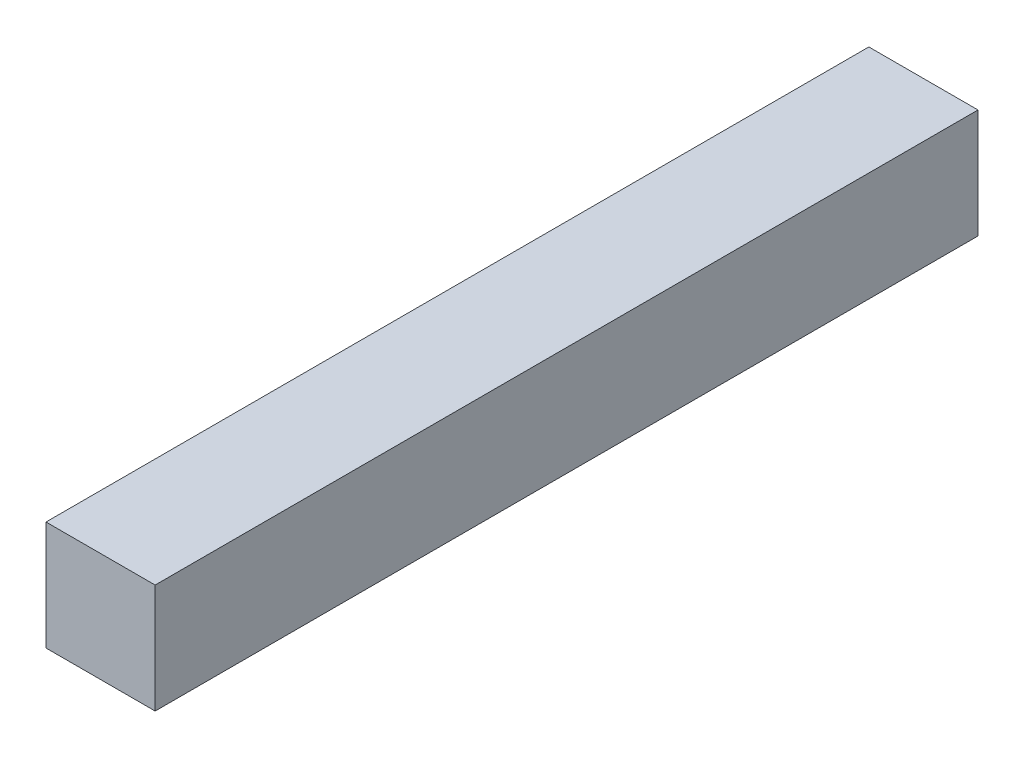
ISO-10303-21;
HEADER;
FILE_DESCRIPTION(('STEP AP214'),'2;1');
FILE_NAME('part.step','',(''),(''),'','','');
FILE_SCHEMA(('AUTOMOTIVE_DESIGN { 1 0 10303 214 1 1 1 1 }'));
ENDSEC;
DATA;
#1=APPLICATION_CONTEXT('core data for automotive mechanical design processes');
#2=APPLICATION_PROTOCOL_DEFINITION('international standard','automotive_design',2000,#1);
#3=PRODUCT_CONTEXT('',#1,'mechanical');
#4=PRODUCT('Part','Part','',(#3));
#5=PRODUCT_RELATED_PRODUCT_CATEGORY('part','',(#4));
#6=PRODUCT_DEFINITION_FORMATION('','',#4);
#7=PRODUCT_DEFINITION_CONTEXT('part definition',#1,'design');
#8=PRODUCT_DEFINITION('design','',#6,#7);
#9=PRODUCT_DEFINITION_SHAPE('','',#8);
#10=(LENGTH_UNIT() NAMED_UNIT(*) SI_UNIT(.MILLI.,.METRE.));
#11=(NAMED_UNIT(*) PLANE_ANGLE_UNIT() SI_UNIT($,.RADIAN.));
#12=(NAMED_UNIT(*) SI_UNIT($,.STERADIAN.) SOLID_ANGLE_UNIT());
#13=UNCERTAINTY_MEASURE_WITH_UNIT(LENGTH_MEASURE(1.E-05),#10,'distance_accuracy_value','');
#14=(GEOMETRIC_REPRESENTATION_CONTEXT(3) GLOBAL_UNCERTAINTY_ASSIGNED_CONTEXT((#13)) GLOBAL_UNIT_ASSIGNED_CONTEXT((#10,
#11,#12)) REPRESENTATION_CONTEXT('',''));
#15=CARTESIAN_POINT('',(0.,0.,0.));
#16=DIRECTION('',(0.,0.,1.));
#17=DIRECTION('',(1.,0.,0.));
#18=AXIS2_PLACEMENT_3D('',#15,#16,#17);
#19=CARTESIAN_POINT('',(0.,0.,-98.));
#20=DIRECTION('',(0.,-1.,0.));
#21=DIRECTION('',(0.,0.,-1.));
#22=AXIS2_PLACEMENT_3D('',#19,#20,#21);
#23=PLANE('',#22);
#24=DIRECTION('',(1.,0.,0.));
#25=VECTOR('',#24,1.);
#26=CARTESIAN_POINT('',(0.,0.,0.));
#27=LINE('',#26,#25);
#28=CARTESIAN_POINT('',(0.,0.,0.));
#29=VERTEX_POINT('',#28);
#30=CARTESIAN_POINT('',(13.,0.,0.));
#31=VERTEX_POINT('',#30);
#32=EDGE_CURVE('E108',#29,#31,#27,.T.);
#33=ORIENTED_EDGE('',*,*,#32,.F.);
#34=DIRECTION('',(0.,0.,1.));
#35=VECTOR('',#34,1.);
#36=CARTESIAN_POINT('',(0.,0.,-98.));
#37=LINE('',#36,#35);
#38=CARTESIAN_POINT('',(0.,0.,-98.));
#39=VERTEX_POINT('',#38);
#40=EDGE_CURVE('E11',#39,#29,#37,.T.);
#41=ORIENTED_EDGE('',*,*,#40,.F.);
#42=DIRECTION('',(1.,0.,0.));
#43=VECTOR('',#42,1.);
#44=CARTESIAN_POINT('',(0.,0.,-98.));
#45=LINE('',#44,#43);
#46=CARTESIAN_POINT('',(13.,0.,-98.));
#47=VERTEX_POINT('',#46);
#48=EDGE_CURVE('E101',#39,#47,#45,.T.);
#49=ORIENTED_EDGE('',*,*,#48,.T.);
#50=DIRECTION('',(0.,0.,1.));
#51=VECTOR('',#50,1.);
#52=CARTESIAN_POINT('',(13.,0.,-98.));
#53=LINE('',#52,#51);
#54=EDGE_CURVE('E40',#47,#31,#53,.T.);
#55=ORIENTED_EDGE('',*,*,#54,.T.);
#56=EDGE_LOOP('',(#33,#41,#49,#55));
#57=FACE_BOUND('',#56,.T.);
#58=ADVANCED_FACE('F37',(#57),#23,.T.);
#59=CARTESIAN_POINT('',(0.,0.,-98.));
#60=DIRECTION('',(1.,0.,0.));
#61=DIRECTION('',(0.,1.,0.));
#62=AXIS2_PLACEMENT_3D('',#59,#60,#61);
#63=PLANE('',#62);
#64=DIRECTION('',(0.,1.,0.));
#65=VECTOR('',#64,1.);
#66=CARTESIAN_POINT('',(0.,0.,0.));
#67=LINE('',#66,#65);
#68=CARTESIAN_POINT('',(0.,13.,0.));
#69=VERTEX_POINT('',#68);
#70=EDGE_CURVE('E71',#29,#69,#67,.T.);
#71=ORIENTED_EDGE('',*,*,#70,.T.);
#72=DIRECTION('',(0.,0.,1.));
#73=VECTOR('',#72,1.);
#74=CARTESIAN_POINT('',(0.,13.,-98.));
#75=LINE('',#74,#73);
#76=CARTESIAN_POINT('',(0.,13.,-98.));
#77=VERTEX_POINT('',#76);
#78=EDGE_CURVE('E47',#77,#69,#75,.T.);
#79=ORIENTED_EDGE('',*,*,#78,.F.);
#80=DIRECTION('',(0.,1.,0.));
#81=VECTOR('',#80,1.);
#82=CARTESIAN_POINT('',(0.,0.,-98.));
#83=LINE('',#82,#81);
#84=EDGE_CURVE('E88',#39,#77,#83,.T.);
#85=ORIENTED_EDGE('',*,*,#84,.F.);
#86=ORIENTED_EDGE('',*,*,#40,.T.);
#87=EDGE_LOOP('',(#71,#79,#85,#86));
#88=FACE_BOUND('',#87,.T.);
#89=ADVANCED_FACE('F124',(#88),#63,.F.);
#90=CARTESIAN_POINT('',(0.,13.,-98.));
#91=DIRECTION('',(0.,-1.,0.));
#92=DIRECTION('',(0.,0.,-1.));
#93=AXIS2_PLACEMENT_3D('',#90,#91,#92);
#94=PLANE('',#93);
#95=DIRECTION('',(1.,0.,0.));
#96=VECTOR('',#95,1.);
#97=CARTESIAN_POINT('',(0.,13.,0.));
#98=LINE('',#97,#96);
#99=CARTESIAN_POINT('',(13.,13.,0.));
#100=VERTEX_POINT('',#99);
#101=EDGE_CURVE('E96',#69,#100,#98,.T.);
#102=ORIENTED_EDGE('',*,*,#101,.T.);
#103=DIRECTION('',(0.,0.,1.));
#104=VECTOR('',#103,1.);
#105=CARTESIAN_POINT('',(13.,13.,-98.));
#106=LINE('',#105,#104);
#107=CARTESIAN_POINT('',(13.,13.,-98.));
#108=VERTEX_POINT('',#107);
#109=EDGE_CURVE('E93',#108,#100,#106,.T.);
#110=ORIENTED_EDGE('',*,*,#109,.F.);
#111=DIRECTION('',(1.,0.,0.));
#112=VECTOR('',#111,1.);
#113=CARTESIAN_POINT('',(0.,13.,-98.));
#114=LINE('',#113,#112);
#115=EDGE_CURVE('E83',#77,#108,#114,.T.);
#116=ORIENTED_EDGE('',*,*,#115,.F.);
#117=ORIENTED_EDGE('',*,*,#78,.T.);
#118=EDGE_LOOP('',(#102,#110,#116,#117));
#119=FACE_BOUND('',#118,.T.);
#120=ADVANCED_FACE('F94',(#119),#94,.F.);
#121=CARTESIAN_POINT('',(13.,0.,-98.));
#122=DIRECTION('',(1.,0.,0.));
#123=DIRECTION('',(0.,1.,0.));
#124=AXIS2_PLACEMENT_3D('',#121,#122,#123);
#125=PLANE('',#124);
#126=DIRECTION('',(0.,1.,0.));
#127=VECTOR('',#126,1.);
#128=CARTESIAN_POINT('',(13.,0.,0.));
#129=LINE('',#128,#127);
#130=EDGE_CURVE('E112',#31,#100,#129,.T.);
#131=ORIENTED_EDGE('',*,*,#130,.F.);
#132=ORIENTED_EDGE('',*,*,#54,.F.);
#133=DIRECTION('',(0.,1.,0.));
#134=VECTOR('',#133,1.);
#135=CARTESIAN_POINT('',(13.,0.,-98.));
#136=LINE('',#135,#134);
#137=EDGE_CURVE('E87',#47,#108,#136,.T.);
#138=ORIENTED_EDGE('',*,*,#137,.T.);
#139=ORIENTED_EDGE('',*,*,#109,.T.);
#140=EDGE_LOOP('',(#131,#132,#138,#139));
#141=FACE_BOUND('',#140,.T.);
#142=ADVANCED_FACE('F99',(#141),#125,.T.);
#143=CARTESIAN_POINT('',(0.,0.,-98.));
#144=DIRECTION('',(0.,0.,1.));
#145=DIRECTION('',(1.,0.,0.));
#146=AXIS2_PLACEMENT_3D('',#143,#144,#145);
#147=PLANE('',#146);
#148=ORIENTED_EDGE('',*,*,#48,.F.);
#149=ORIENTED_EDGE('',*,*,#84,.T.);
#150=ORIENTED_EDGE('',*,*,#115,.T.);
#151=ORIENTED_EDGE('',*,*,#137,.F.);
#152=EDGE_LOOP('',(#148,#149,#150,#151));
#153=FACE_BOUND('',#152,.T.);
#154=ADVANCED_FACE('F86',(#153),#147,.F.);
#155=CARTESIAN_POINT('',(0.,0.,0.));
#156=DIRECTION('',(0.,0.,1.));
#157=DIRECTION('',(1.,0.,0.));
#158=AXIS2_PLACEMENT_3D('',#155,#156,#157);
#159=PLANE('',#158);
#160=ORIENTED_EDGE('',*,*,#32,.T.);
#161=ORIENTED_EDGE('',*,*,#130,.T.);
#162=ORIENTED_EDGE('',*,*,#101,.F.);
#163=ORIENTED_EDGE('',*,*,#70,.F.);
#164=EDGE_LOOP('',(#160,#161,#162,#163));
#165=FACE_BOUND('',#164,.T.);
#166=ADVANCED_FACE('F121',(#165),#159,.T.);
#167=CLOSED_SHELL('',(#58,#89,#120,#142,#154,#166));
#168=MANIFOLD_SOLID_BREP('B2',#167);
#169=ADVANCED_BREP_SHAPE_REPRESENTATION('',(#18,#168),#14);
#170=SHAPE_DEFINITION_REPRESENTATION(#9,#169);
ENDSEC;
END-ISO-10303-21;
